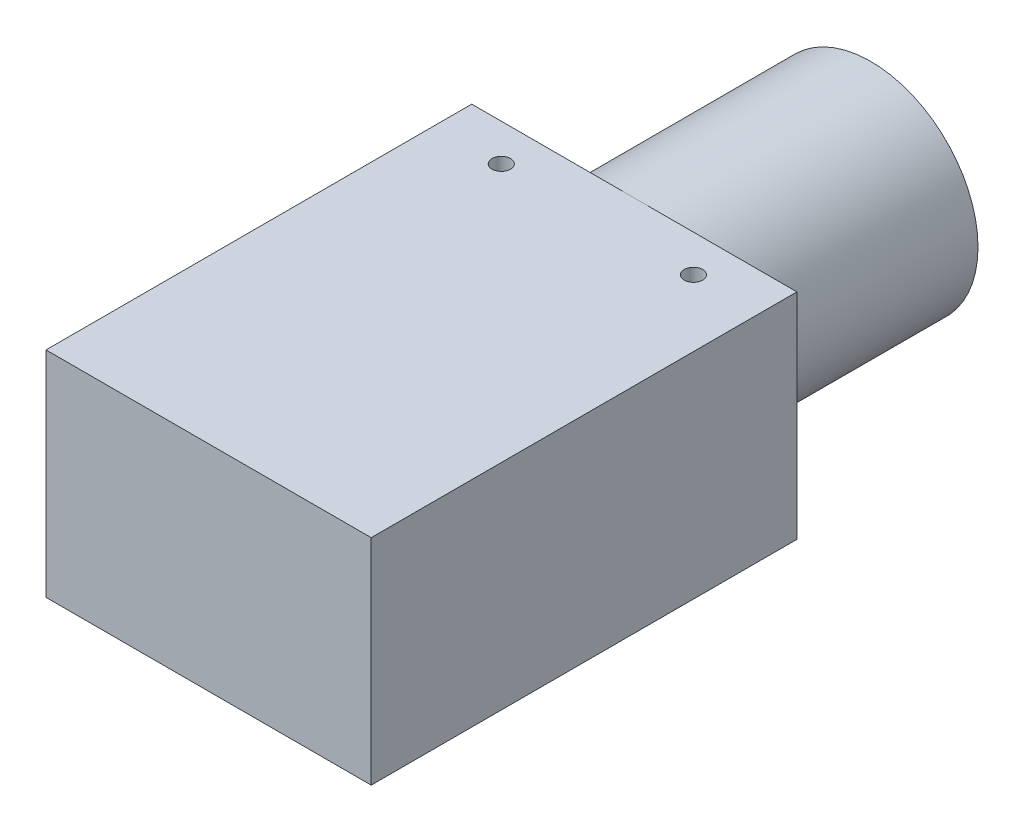
ISO-10303-21;
HEADER;
FILE_DESCRIPTION(('STEP AP214'),'2;1');
FILE_NAME('part.step','',(''),(''),'','','');
FILE_SCHEMA(('AUTOMOTIVE_DESIGN { 1 0 10303 214 1 1 1 1 }'));
ENDSEC;
DATA;
#1=APPLICATION_CONTEXT('core data for automotive mechanical design processes');
#2=APPLICATION_PROTOCOL_DEFINITION('international standard','automotive_design',2000,#1);
#3=PRODUCT_CONTEXT('',#1,'mechanical');
#4=PRODUCT('Part','Part','',(#3));
#5=PRODUCT_RELATED_PRODUCT_CATEGORY('part','',(#4));
#6=PRODUCT_DEFINITION_FORMATION('','',#4);
#7=PRODUCT_DEFINITION_CONTEXT('part definition',#1,'design');
#8=PRODUCT_DEFINITION('design','',#6,#7);
#9=PRODUCT_DEFINITION_SHAPE('','',#8);
#10=(LENGTH_UNIT() NAMED_UNIT(*) SI_UNIT(.MILLI.,.METRE.));
#11=(NAMED_UNIT(*) PLANE_ANGLE_UNIT() SI_UNIT($,.RADIAN.));
#12=(NAMED_UNIT(*) SI_UNIT($,.STERADIAN.) SOLID_ANGLE_UNIT());
#13=UNCERTAINTY_MEASURE_WITH_UNIT(LENGTH_MEASURE(1.E-05),#10,'distance_accuracy_value','');
#14=(GEOMETRIC_REPRESENTATION_CONTEXT(3) GLOBAL_UNCERTAINTY_ASSIGNED_CONTEXT((#13)) GLOBAL_UNIT_ASSIGNED_CONTEXT((#10,
#11,#12)) REPRESENTATION_CONTEXT('',''));
#15=CARTESIAN_POINT('',(0.,0.,0.));
#16=DIRECTION('',(0.,0.,1.));
#17=DIRECTION('',(1.,0.,0.));
#18=AXIS2_PLACEMENT_3D('',#15,#16,#17);
#19=CARTESIAN_POINT('',(0.,0.,0.));
#20=DIRECTION('',(0.,0.,-1.));
#21=DIRECTION('',(-1.,0.,0.));
#22=AXIS2_PLACEMENT_3D('',#19,#20,#21);
#23=PLANE('',#22);
#24=DIRECTION('',(-1.,0.,0.));
#25=VECTOR('',#24,1.);
#26=CARTESIAN_POINT('',(-22.,14.5,0.));
#27=LINE('',#26,#25);
#28=CARTESIAN_POINT('',(0.,14.5,0.));
#29=VERTEX_POINT('',#28);
#30=CARTESIAN_POINT('',(-22.,14.5,0.));
#31=VERTEX_POINT('',#30);
#32=EDGE_CURVE('E131',#29,#31,#27,.T.);
#33=ORIENTED_EDGE('',*,*,#32,.F.);
#34=CARTESIAN_POINT('',(0.,0.,0.));
#35=DIRECTION('',(0.,0.,1.));
#36=DIRECTION('',(1.,0.,0.));
#37=AXIS2_PLACEMENT_3D('',#34,#35,#36);
#38=CIRCLE('',#37,14.5);
#39=CARTESIAN_POINT('',(0.,-14.5,0.));
#40=VERTEX_POINT('',#39);
#41=EDGE_CURVE('E45',#29,#40,#38,.T.);
#42=ORIENTED_EDGE('',*,*,#41,.T.);
#43=DIRECTION('',(1.,0.,0.));
#44=VECTOR('',#43,1.);
#45=CARTESIAN_POINT('',(-22.,-14.5,0.));
#46=LINE('',#45,#44);
#47=CARTESIAN_POINT('',(-22.,-14.5,0.));
#48=VERTEX_POINT('',#47);
#49=EDGE_CURVE('E123',#48,#40,#46,.T.);
#50=ORIENTED_EDGE('',*,*,#49,.F.);
#51=DIRECTION('',(0.,-1.,0.));
#52=VECTOR('',#51,1.);
#53=CARTESIAN_POINT('',(-22.,-14.5,0.));
#54=LINE('',#53,#52);
#55=EDGE_CURVE('E135',#31,#48,#54,.T.);
#56=ORIENTED_EDGE('',*,*,#55,.F.);
#57=EDGE_LOOP('',(#33,#42,#50,#56));
#58=FACE_BOUND('',#57,.T.);
#59=ADVANCED_FACE('F35',(#58),#23,.T.);
#60=CARTESIAN_POINT('',(22.,-14.5,57.6));
#61=DIRECTION('',(-1.,0.,0.));
#62=DIRECTION('',(0.,0.,1.));
#63=AXIS2_PLACEMENT_3D('',#60,#61,#62);
#64=PLANE('',#63);
#65=DIRECTION('',(0.,1.,0.));
#66=VECTOR('',#65,1.);
#67=CARTESIAN_POINT('',(22.,-14.5,0.));
#68=LINE('',#67,#66);
#69=CARTESIAN_POINT('',(22.,-14.5,0.));
#70=VERTEX_POINT('',#69);
#71=CARTESIAN_POINT('',(22.,14.5,0.));
#72=VERTEX_POINT('',#71);
#73=EDGE_CURVE('E119',#70,#72,#68,.T.);
#74=ORIENTED_EDGE('',*,*,#73,.T.);
#75=DIRECTION('',(0.,0.,-1.));
#76=VECTOR('',#75,1.);
#77=CARTESIAN_POINT('',(22.,14.5,57.6));
#78=LINE('',#77,#76);
#79=CARTESIAN_POINT('',(22.,14.5,57.6));
#80=VERTEX_POINT('',#79);
#81=EDGE_CURVE('E39',#80,#72,#78,.T.);
#82=ORIENTED_EDGE('',*,*,#81,.F.);
#83=DIRECTION('',(0.,1.,0.));
#84=VECTOR('',#83,1.);
#85=CARTESIAN_POINT('',(22.,-14.5,57.6));
#86=LINE('',#85,#84);
#87=CARTESIAN_POINT('',(22.,-14.5,57.6));
#88=VERTEX_POINT('',#87);
#89=EDGE_CURVE('E121',#88,#80,#86,.T.);
#90=ORIENTED_EDGE('',*,*,#89,.F.);
#91=DIRECTION('',(0.,0.,-1.));
#92=VECTOR('',#91,1.);
#93=CARTESIAN_POINT('',(22.,-14.5,57.6));
#94=LINE('',#93,#92);
#95=EDGE_CURVE('E128',#88,#70,#94,.T.);
#96=ORIENTED_EDGE('',*,*,#95,.T.);
#97=EDGE_LOOP('',(#74,#82,#90,#96));
#98=FACE_BOUND('',#97,.T.);
#99=ADVANCED_FACE('F37',(#98),#64,.F.);
#100=CARTESIAN_POINT('',(-22.,14.5,57.6));
#101=DIRECTION('',(0.,-1.,0.));
#102=DIRECTION('',(0.,0.,-1.));
#103=AXIS2_PLACEMENT_3D('',#100,#101,#102);
#104=PLANE('',#103);
#105=CARTESIAN_POINT('',(-13.,14.5,5.));
#106=DIRECTION('',(0.,1.,0.));
#107=DIRECTION('',(0.,0.,1.));
#108=AXIS2_PLACEMENT_3D('',#105,#106,#107);
#109=CIRCLE('',#108,1.24999999999999);
#110=CARTESIAN_POINT('',(-13.,14.5,6.24999999999999));
#111=VERTEX_POINT('',#110);
#112=EDGE_CURVE('E107',#111,#111,#109,.T.);
#113=ORIENTED_EDGE('',*,*,#112,.F.);
#114=EDGE_LOOP('',(#113));
#115=FACE_BOUND('',#114,.T.);
#116=CARTESIAN_POINT('',(13.,14.5,5.));
#117=DIRECTION('',(0.,1.,0.));
#118=DIRECTION('',(0.,0.,1.));
#119=AXIS2_PLACEMENT_3D('',#116,#117,#118);
#120=CIRCLE('',#119,1.24999999999999);
#121=CARTESIAN_POINT('',(13.,14.5,6.24999999999999));
#122=VERTEX_POINT('',#121);
#123=EDGE_CURVE('E106',#122,#122,#120,.T.);
#124=ORIENTED_EDGE('',*,*,#123,.F.);
#125=EDGE_LOOP('',(#124));
#126=FACE_BOUND('',#125,.T.);
#127=EDGE_CURVE('E132',#72,#29,#27,.T.);
#128=ORIENTED_EDGE('',*,*,#127,.T.);
#129=ORIENTED_EDGE('',*,*,#32,.T.);
#130=DIRECTION('',(0.,0.,-1.));
#131=VECTOR('',#130,1.);
#132=CARTESIAN_POINT('',(-22.,14.5,57.6));
#133=LINE('',#132,#131);
#134=CARTESIAN_POINT('',(-22.,14.5,57.6));
#135=VERTEX_POINT('',#134);
#136=EDGE_CURVE('E141',#135,#31,#133,.T.);
#137=ORIENTED_EDGE('',*,*,#136,.F.);
#138=DIRECTION('',(-1.,0.,0.));
#139=VECTOR('',#138,1.);
#140=CARTESIAN_POINT('',(-22.,14.5,57.6));
#141=LINE('',#140,#139);
#142=EDGE_CURVE('E87',#80,#135,#141,.T.);
#143=ORIENTED_EDGE('',*,*,#142,.F.);
#144=ORIENTED_EDGE('',*,*,#81,.T.);
#145=EDGE_LOOP('',(#128,#129,#137,#143,#144));
#146=FACE_BOUND('',#145,.T.);
#147=ADVANCED_FACE('F147',(#115,#126,#146),#104,.F.);
#148=CARTESIAN_POINT('',(-22.,-14.5,57.6));
#149=DIRECTION('',(1.,0.,0.));
#150=DIRECTION('',(0.,0.,-1.));
#151=AXIS2_PLACEMENT_3D('',#148,#149,#150);
#152=PLANE('',#151);
#153=ORIENTED_EDGE('',*,*,#55,.T.);
#154=DIRECTION('',(0.,0.,-1.));
#155=VECTOR('',#154,1.);
#156=CARTESIAN_POINT('',(-22.,-14.5,57.6));
#157=LINE('',#156,#155);
#158=CARTESIAN_POINT('',(-22.,-14.5,57.6));
#159=VERTEX_POINT('',#158);
#160=EDGE_CURVE('E139',#159,#48,#157,.T.);
#161=ORIENTED_EDGE('',*,*,#160,.F.);
#162=DIRECTION('',(0.,-1.,0.));
#163=VECTOR('',#162,1.);
#164=CARTESIAN_POINT('',(-22.,-14.5,57.6));
#165=LINE('',#164,#163);
#166=EDGE_CURVE('E125',#135,#159,#165,.T.);
#167=ORIENTED_EDGE('',*,*,#166,.F.);
#168=ORIENTED_EDGE('',*,*,#136,.T.);
#169=EDGE_LOOP('',(#153,#161,#167,#168));
#170=FACE_BOUND('',#169,.T.);
#171=ADVANCED_FACE('F157',(#170),#152,.F.);
#172=CARTESIAN_POINT('',(-22.,-14.5,57.6));
#173=DIRECTION('',(0.,1.,0.));
#174=DIRECTION('',(0.,0.,1.));
#175=AXIS2_PLACEMENT_3D('',#172,#173,#174);
#176=PLANE('',#175);
#177=ORIENTED_EDGE('',*,*,#49,.T.);
#178=EDGE_CURVE('E79',#40,#70,#46,.T.);
#179=ORIENTED_EDGE('',*,*,#178,.T.);
#180=ORIENTED_EDGE('',*,*,#95,.F.);
#181=DIRECTION('',(1.,0.,0.));
#182=VECTOR('',#181,1.);
#183=CARTESIAN_POINT('',(-22.,-14.5,57.6));
#184=LINE('',#183,#182);
#185=EDGE_CURVE('E58',#159,#88,#184,.T.);
#186=ORIENTED_EDGE('',*,*,#185,.F.);
#187=ORIENTED_EDGE('',*,*,#160,.T.);
#188=EDGE_LOOP('',(#177,#179,#180,#186,#187));
#189=FACE_BOUND('',#188,.T.);
#190=ADVANCED_FACE('F160',(#189),#176,.F.);
#191=CARTESIAN_POINT('',(0.,0.,57.6));
#192=DIRECTION('',(0.,0.,-1.));
#193=DIRECTION('',(-1.,0.,0.));
#194=AXIS2_PLACEMENT_3D('',#191,#192,#193);
#195=PLANE('',#194);
#196=ORIENTED_EDGE('',*,*,#89,.T.);
#197=ORIENTED_EDGE('',*,*,#142,.T.);
#198=ORIENTED_EDGE('',*,*,#166,.T.);
#199=ORIENTED_EDGE('',*,*,#185,.T.);
#200=EDGE_LOOP('',(#196,#197,#198,#199));
#201=FACE_BOUND('',#200,.T.);
#202=ADVANCED_FACE('F158',(#201),#195,.F.);
#203=ORIENTED_EDGE('',*,*,#178,.F.);
#204=EDGE_CURVE('E11',#40,#29,#38,.T.);
#205=ORIENTED_EDGE('',*,*,#204,.T.);
#206=ORIENTED_EDGE('',*,*,#127,.F.);
#207=ORIENTED_EDGE('',*,*,#73,.F.);
#208=EDGE_LOOP('',(#203,#205,#206,#207));
#209=FACE_BOUND('',#208,.T.);
#210=ADVANCED_FACE('F152',(#209),#23,.T.);
#211=CARTESIAN_POINT('',(0.,0.,-32.));
#212=DIRECTION('',(0.,0.,1.));
#213=DIRECTION('',(1.,0.,0.));
#214=AXIS2_PLACEMENT_3D('',#211,#212,#213);
#215=CYLINDRICAL_SURFACE('',#214,14.5);
#216=CARTESIAN_POINT('',(0.,0.,-32.));
#217=DIRECTION('',(0.,0.,1.));
#218=DIRECTION('',(1.,0.,0.));
#219=AXIS2_PLACEMENT_3D('',#216,#217,#218);
#220=CIRCLE('',#219,14.5);
#221=CARTESIAN_POINT('',(14.5,0.,-32.));
#222=VERTEX_POINT('',#221);
#223=EDGE_CURVE('E117',#222,#222,#220,.T.);
#224=ORIENTED_EDGE('',*,*,#223,.T.);
#225=EDGE_LOOP('',(#224));
#226=FACE_BOUND('',#225,.T.);
#227=ORIENTED_EDGE('',*,*,#41,.F.);
#228=ORIENTED_EDGE('',*,*,#204,.F.);
#229=EDGE_LOOP('',(#227,#228));
#230=FACE_BOUND('',#229,.T.);
#231=ADVANCED_FACE('F166',(#226,#230),#215,.T.);
#232=CARTESIAN_POINT('',(0.,0.,-32.));
#233=DIRECTION('',(0.,0.,1.));
#234=DIRECTION('',(1.,0.,0.));
#235=AXIS2_PLACEMENT_3D('',#232,#233,#234);
#236=PLANE('',#235);
#237=ORIENTED_EDGE('',*,*,#223,.F.);
#238=EDGE_LOOP('',(#237));
#239=FACE_BOUND('',#238,.T.);
#240=ADVANCED_FACE('F191',(#239),#236,.F.);
#241=CARTESIAN_POINT('',(13.,11.5,5.));
#242=DIRECTION('',(0.,1.,0.));
#243=DIRECTION('',(0.,0.,1.));
#244=AXIS2_PLACEMENT_3D('',#241,#242,#243);
#245=CONICAL_SURFACE('',#244,1.24999999999999,1.02974425867665);
#246=CARTESIAN_POINT('',(13.,10.7489242262156,5.));
#247=VERTEX_POINT('',#246);
#248=VERTEX_LOOP('',#247);
#249=FACE_BOUND('',#248,.T.);
#250=CARTESIAN_POINT('',(13.,11.5,5.));
#251=DIRECTION('',(0.,1.,0.));
#252=DIRECTION('',(0.,0.,1.));
#253=AXIS2_PLACEMENT_3D('',#250,#251,#252);
#254=CIRCLE('',#253,1.24999999999999);
#255=CARTESIAN_POINT('',(13.,11.5,6.24999999999999));
#256=VERTEX_POINT('',#255);
#257=EDGE_CURVE('E110',#256,#256,#254,.T.);
#258=ORIENTED_EDGE('',*,*,#257,.T.);
#259=EDGE_LOOP('',(#258));
#260=FACE_BOUND('',#259,.T.);
#261=ADVANCED_FACE('F185',(#249,#260),#245,.F.);
#262=CARTESIAN_POINT('',(13.,14.5,5.));
#263=DIRECTION('',(0.,1.,0.));
#264=DIRECTION('',(0.,0.,1.));
#265=AXIS2_PLACEMENT_3D('',#262,#263,#264);
#266=CYLINDRICAL_SURFACE('',#265,1.24999999999999);
#267=ORIENTED_EDGE('',*,*,#257,.F.);
#268=EDGE_LOOP('',(#267));
#269=FACE_BOUND('',#268,.T.);
#270=ORIENTED_EDGE('',*,*,#123,.T.);
#271=EDGE_LOOP('',(#270));
#272=FACE_BOUND('',#271,.T.);
#273=ADVANCED_FACE('F100',(#269,#272),#266,.F.);
#274=CARTESIAN_POINT('',(-13.,11.5,5.));
#275=DIRECTION('',(0.,1.,0.));
#276=DIRECTION('',(0.,0.,1.));
#277=AXIS2_PLACEMENT_3D('',#274,#275,#276);
#278=CONICAL_SURFACE('',#277,1.24999999999999,1.02974425867665);
#279=CARTESIAN_POINT('',(-13.,10.7489242262156,5.));
#280=VERTEX_POINT('',#279);
#281=VERTEX_LOOP('',#280);
#282=FACE_BOUND('',#281,.T.);
#283=CARTESIAN_POINT('',(-13.,11.5,5.));
#284=DIRECTION('',(0.,1.,0.));
#285=DIRECTION('',(0.,0.,1.));
#286=AXIS2_PLACEMENT_3D('',#283,#284,#285);
#287=CIRCLE('',#286,1.24999999999999);
#288=CARTESIAN_POINT('',(-13.,11.5,6.24999999999999));
#289=VERTEX_POINT('',#288);
#290=EDGE_CURVE('E104',#289,#289,#287,.T.);
#291=ORIENTED_EDGE('',*,*,#290,.T.);
#292=EDGE_LOOP('',(#291));
#293=FACE_BOUND('',#292,.T.);
#294=ADVANCED_FACE('F96',(#282,#293),#278,.F.);
#295=CARTESIAN_POINT('',(-13.,14.5,5.));
#296=DIRECTION('',(0.,1.,0.));
#297=DIRECTION('',(0.,0.,1.));
#298=AXIS2_PLACEMENT_3D('',#295,#296,#297);
#299=CYLINDRICAL_SURFACE('',#298,1.24999999999999);
#300=ORIENTED_EDGE('',*,*,#290,.F.);
#301=EDGE_LOOP('',(#300));
#302=FACE_BOUND('',#301,.T.);
#303=ORIENTED_EDGE('',*,*,#112,.T.);
#304=EDGE_LOOP('',(#303));
#305=FACE_BOUND('',#304,.T.);
#306=ADVANCED_FACE('F99',(#302,#305),#299,.F.);
#307=CLOSED_SHELL('',(#59,#99,#147,#171,#190,#202,#210,#231,#240,#261,#273,#294,#306));
#308=MANIFOLD_SOLID_BREP('B2',#307);
#309=ADVANCED_BREP_SHAPE_REPRESENTATION('',(#18,#308),#14);
#310=SHAPE_DEFINITION_REPRESENTATION(#9,#309);
ENDSEC;
END-ISO-10303-21;
